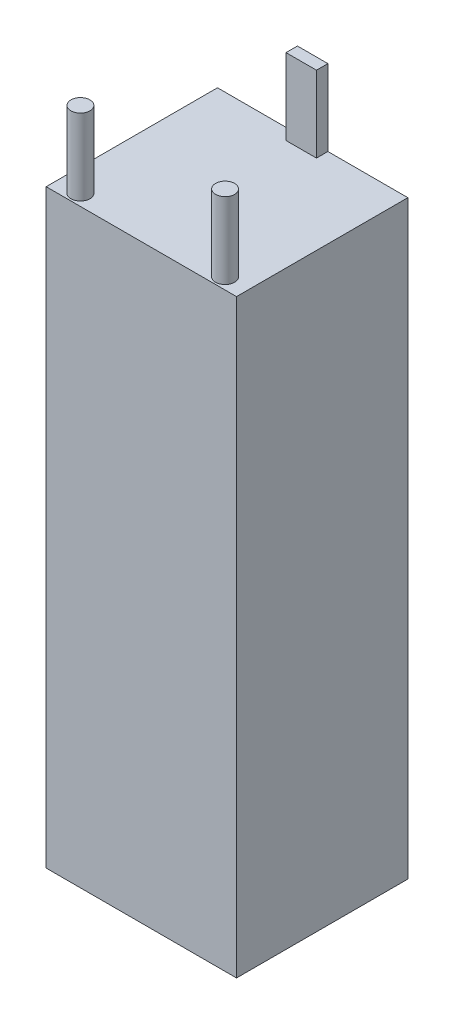
ISO-10303-21;
HEADER;
FILE_DESCRIPTION(('STEP AP214'),'2;1');
FILE_NAME('part.step','',(''),(''),'','','');
FILE_SCHEMA(('AUTOMOTIVE_DESIGN { 1 0 10303 214 1 1 1 1 }'));
ENDSEC;
DATA;
#1=APPLICATION_CONTEXT('core data for automotive mechanical design processes');
#2=APPLICATION_PROTOCOL_DEFINITION('international standard','automotive_design',2000,#1);
#3=PRODUCT_CONTEXT('',#1,'mechanical');
#4=PRODUCT('Part','Part','',(#3));
#5=PRODUCT_RELATED_PRODUCT_CATEGORY('part','',(#4));
#6=PRODUCT_DEFINITION_FORMATION('','',#4);
#7=PRODUCT_DEFINITION_CONTEXT('part definition',#1,'design');
#8=PRODUCT_DEFINITION('design','',#6,#7);
#9=PRODUCT_DEFINITION_SHAPE('','',#8);
#10=(LENGTH_UNIT() NAMED_UNIT(*) SI_UNIT(.MILLI.,.METRE.));
#11=(NAMED_UNIT(*) PLANE_ANGLE_UNIT() SI_UNIT($,.RADIAN.));
#12=(NAMED_UNIT(*) SI_UNIT($,.STERADIAN.) SOLID_ANGLE_UNIT());
#13=UNCERTAINTY_MEASURE_WITH_UNIT(LENGTH_MEASURE(1.E-05),#10,'distance_accuracy_value','');
#14=(GEOMETRIC_REPRESENTATION_CONTEXT(3) GLOBAL_UNCERTAINTY_ASSIGNED_CONTEXT((#13)) GLOBAL_UNIT_ASSIGNED_CONTEXT((#10,
#11,#12)) REPRESENTATION_CONTEXT('',''));
#15=CARTESIAN_POINT('',(0.,0.,0.));
#16=DIRECTION('',(0.,0.,1.));
#17=DIRECTION('',(1.,0.,0.));
#18=AXIS2_PLACEMENT_3D('',#15,#16,#17);
#19=CARTESIAN_POINT('',(25.,155.,22.5));
#20=DIRECTION('',(-1.,0.,0.));
#21=DIRECTION('',(0.,0.,1.));
#22=AXIS2_PLACEMENT_3D('',#19,#20,#21);
#23=PLANE('',#22);
#24=DIRECTION('',(0.,0.,-1.));
#25=VECTOR('',#24,1.);
#26=CARTESIAN_POINT('',(25.,0.,22.5));
#27=LINE('',#26,#25);
#28=CARTESIAN_POINT('',(25.,0.,22.5));
#29=VERTEX_POINT('',#28);
#30=CARTESIAN_POINT('',(25.,0.,-22.5));
#31=VERTEX_POINT('',#30);
#32=EDGE_CURVE('E169',#29,#31,#27,.T.);
#33=ORIENTED_EDGE('',*,*,#32,.T.);
#34=DIRECTION('',(0.,-1.,0.));
#35=VECTOR('',#34,1.);
#36=CARTESIAN_POINT('',(25.,155.,-22.5));
#37=LINE('',#36,#35);
#38=CARTESIAN_POINT('',(25.,155.,-22.5));
#39=VERTEX_POINT('',#38);
#40=EDGE_CURVE('E193',#39,#31,#37,.T.);
#41=ORIENTED_EDGE('',*,*,#40,.F.);
#42=DIRECTION('',(0.,0.,-1.));
#43=VECTOR('',#42,1.);
#44=CARTESIAN_POINT('',(25.,155.,22.5));
#45=LINE('',#44,#43);
#46=CARTESIAN_POINT('',(25.,155.,22.5));
#47=VERTEX_POINT('',#46);
#48=EDGE_CURVE('E153',#47,#39,#45,.T.);
#49=ORIENTED_EDGE('',*,*,#48,.F.);
#50=DIRECTION('',(0.,-1.,0.));
#51=VECTOR('',#50,1.);
#52=CARTESIAN_POINT('',(25.,155.,22.5));
#53=LINE('',#52,#51);
#54=EDGE_CURVE('E168',#47,#29,#53,.T.);
#55=ORIENTED_EDGE('',*,*,#54,.T.);
#56=EDGE_LOOP('',(#33,#41,#49,#55));
#57=FACE_BOUND('',#56,.T.);
#58=ADVANCED_FACE('F45',(#57),#23,.F.);
#59=CARTESIAN_POINT('',(-25.,155.,-22.5));
#60=DIRECTION('',(0.,0.,1.));
#61=DIRECTION('',(1.,0.,0.));
#62=AXIS2_PLACEMENT_3D('',#59,#60,#61);
#63=PLANE('',#62);
#64=DIRECTION('',(-1.,0.,0.));
#65=VECTOR('',#64,1.);
#66=CARTESIAN_POINT('',(-25.,0.,-22.5));
#67=LINE('',#66,#65);
#68=CARTESIAN_POINT('',(-25.,0.,-22.5));
#69=VERTEX_POINT('',#68);
#70=EDGE_CURVE('E173',#31,#69,#67,.T.);
#71=ORIENTED_EDGE('',*,*,#70,.T.);
#72=DIRECTION('',(0.,-1.,0.));
#73=VECTOR('',#72,1.);
#74=CARTESIAN_POINT('',(-25.,155.,-22.5));
#75=LINE('',#74,#73);
#76=CARTESIAN_POINT('',(-25.,155.,-22.5));
#77=VERTEX_POINT('',#76);
#78=EDGE_CURVE('E189',#77,#69,#75,.T.);
#79=ORIENTED_EDGE('',*,*,#78,.F.);
#80=DIRECTION('',(-1.,0.,0.));
#81=VECTOR('',#80,1.);
#82=CARTESIAN_POINT('',(-25.,155.,-22.5));
#83=LINE('',#82,#81);
#84=CARTESIAN_POINT('',(-4.00000000000001,155.,-22.5));
#85=VERTEX_POINT('',#84);
#86=EDGE_CURVE('E157',#85,#77,#83,.T.);
#87=ORIENTED_EDGE('',*,*,#86,.F.);
#88=DIRECTION('',(0.,-1.,0.));
#89=VECTOR('',#88,1.);
#90=CARTESIAN_POINT('',(-4.,175.,-22.5));
#91=LINE('',#90,#89);
#92=CARTESIAN_POINT('',(-4.,175.,-22.5));
#93=VERTEX_POINT('',#92);
#94=EDGE_CURVE('E124',#93,#85,#91,.T.);
#95=ORIENTED_EDGE('',*,*,#94,.F.);
#96=DIRECTION('',(-1.,0.,0.));
#97=VECTOR('',#96,1.);
#98=CARTESIAN_POINT('',(-4.,175.,-22.5));
#99=LINE('',#98,#97);
#100=CARTESIAN_POINT('',(4.,175.,-22.5));
#101=VERTEX_POINT('',#100);
#102=EDGE_CURVE('E147',#101,#93,#99,.T.);
#103=ORIENTED_EDGE('',*,*,#102,.F.);
#104=DIRECTION('',(0.,-1.,0.));
#105=VECTOR('',#104,1.);
#106=CARTESIAN_POINT('',(4.,175.,-22.5));
#107=LINE('',#106,#105);
#108=CARTESIAN_POINT('',(3.99999999999999,155.,-22.5));
#109=VERTEX_POINT('',#108);
#110=EDGE_CURVE('E135',#101,#109,#107,.T.);
#111=ORIENTED_EDGE('',*,*,#110,.T.);
#112=EDGE_CURVE('E159',#39,#109,#83,.T.);
#113=ORIENTED_EDGE('',*,*,#112,.F.);
#114=ORIENTED_EDGE('',*,*,#40,.T.);
#115=EDGE_LOOP('',(#71,#79,#87,#95,#103,#111,#113,#114));
#116=FACE_BOUND('',#115,.T.);
#117=ADVANCED_FACE('F219',(#116),#63,.F.);
#118=CARTESIAN_POINT('',(-25.,155.,22.5));
#119=DIRECTION('',(1.,0.,0.));
#120=DIRECTION('',(0.,0.,-1.));
#121=AXIS2_PLACEMENT_3D('',#118,#119,#120);
#122=PLANE('',#121);
#123=DIRECTION('',(0.,0.,1.));
#124=VECTOR('',#123,1.);
#125=CARTESIAN_POINT('',(-25.,0.,22.5));
#126=LINE('',#125,#124);
#127=CARTESIAN_POINT('',(-25.,0.,22.5));
#128=VERTEX_POINT('',#127);
#129=EDGE_CURVE('E177',#69,#128,#126,.T.);
#130=ORIENTED_EDGE('',*,*,#129,.T.);
#131=DIRECTION('',(0.,-1.,0.));
#132=VECTOR('',#131,1.);
#133=CARTESIAN_POINT('',(-25.,155.,22.5));
#134=LINE('',#133,#132);
#135=CARTESIAN_POINT('',(-25.,155.,22.5));
#136=VERTEX_POINT('',#135);
#137=EDGE_CURVE('E185',#136,#128,#134,.T.);
#138=ORIENTED_EDGE('',*,*,#137,.F.);
#139=DIRECTION('',(0.,0.,1.));
#140=VECTOR('',#139,1.);
#141=CARTESIAN_POINT('',(-25.,155.,22.5));
#142=LINE('',#141,#140);
#143=EDGE_CURVE('E162',#77,#136,#142,.T.);
#144=ORIENTED_EDGE('',*,*,#143,.F.);
#145=ORIENTED_EDGE('',*,*,#78,.T.);
#146=EDGE_LOOP('',(#130,#138,#144,#145));
#147=FACE_BOUND('',#146,.T.);
#148=ADVANCED_FACE('F214',(#147),#122,.F.);
#149=CARTESIAN_POINT('',(-25.,155.,22.5));
#150=DIRECTION('',(0.,0.,-1.));
#151=DIRECTION('',(-1.,0.,0.));
#152=AXIS2_PLACEMENT_3D('',#149,#150,#151);
#153=PLANE('',#152);
#154=DIRECTION('',(1.,0.,0.));
#155=VECTOR('',#154,1.);
#156=CARTESIAN_POINT('',(-25.,0.,22.5));
#157=LINE('',#156,#155);
#158=EDGE_CURVE('E158',#128,#29,#157,.T.);
#159=ORIENTED_EDGE('',*,*,#158,.T.);
#160=ORIENTED_EDGE('',*,*,#54,.F.);
#161=DIRECTION('',(1.,0.,0.));
#162=VECTOR('',#161,1.);
#163=CARTESIAN_POINT('',(-25.,155.,22.5));
#164=LINE('',#163,#162);
#165=EDGE_CURVE('E165',#136,#47,#164,.T.);
#166=ORIENTED_EDGE('',*,*,#165,.F.);
#167=ORIENTED_EDGE('',*,*,#137,.T.);
#168=EDGE_LOOP('',(#159,#160,#166,#167));
#169=FACE_BOUND('',#168,.T.);
#170=ADVANCED_FACE('F204',(#169),#153,.F.);
#171=CARTESIAN_POINT('',(0.,155.,0.));
#172=DIRECTION('',(0.,-1.,0.));
#173=DIRECTION('',(0.,0.,-1.));
#174=AXIS2_PLACEMENT_3D('',#171,#172,#173);
#175=PLANE('',#174);
#176=DIRECTION('',(0.,0.,-1.));
#177=VECTOR('',#176,1.);
#178=CARTESIAN_POINT('',(4.,155.,-19.5));
#179=LINE('',#178,#177);
#180=CARTESIAN_POINT('',(4.,155.,-19.5));
#181=VERTEX_POINT('',#180);
#182=EDGE_CURVE('E60',#181,#109,#179,.T.);
#183=ORIENTED_EDGE('',*,*,#182,.F.);
#184=DIRECTION('',(1.,0.,0.));
#185=VECTOR('',#184,1.);
#186=CARTESIAN_POINT('',(-4.,155.,-19.5));
#187=LINE('',#186,#185);
#188=CARTESIAN_POINT('',(-4.,155.,-19.5));
#189=VERTEX_POINT('',#188);
#190=EDGE_CURVE('E106',#189,#181,#187,.T.);
#191=ORIENTED_EDGE('',*,*,#190,.F.);
#192=DIRECTION('',(0.,0.,1.));
#193=VECTOR('',#192,1.);
#194=CARTESIAN_POINT('',(-4.,155.,-19.5));
#195=LINE('',#194,#193);
#196=EDGE_CURVE('E66',#85,#189,#195,.T.);
#197=ORIENTED_EDGE('',*,*,#196,.F.);
#198=ORIENTED_EDGE('',*,*,#86,.T.);
#199=ORIENTED_EDGE('',*,*,#143,.T.);
#200=ORIENTED_EDGE('',*,*,#165,.T.);
#201=ORIENTED_EDGE('',*,*,#48,.T.);
#202=ORIENTED_EDGE('',*,*,#112,.T.);
#203=EDGE_LOOP('',(#183,#191,#197,#198,#199,#200,#201,#202));
#204=FACE_BOUND('',#203,.T.);
#205=CARTESIAN_POINT('',(-19.,155.,19.5));
#206=DIRECTION('',(0.,-1.,0.));
#207=DIRECTION('',(0.,0.,-1.));
#208=AXIS2_PLACEMENT_3D('',#205,#206,#207);
#209=CIRCLE('',#208,2.5);
#210=CARTESIAN_POINT('',(-19.,155.,17.));
#211=VERTEX_POINT('',#210);
#212=EDGE_CURVE('E11',#211,#211,#209,.F.);
#213=ORIENTED_EDGE('',*,*,#212,.F.);
#214=EDGE_LOOP('',(#213));
#215=FACE_BOUND('',#214,.T.);
#216=CARTESIAN_POINT('',(19.,155.,19.5));
#217=DIRECTION('',(0.,-1.,0.));
#218=DIRECTION('',(0.,0.,-1.));
#219=AXIS2_PLACEMENT_3D('',#216,#217,#218);
#220=CIRCLE('',#219,2.5);
#221=CARTESIAN_POINT('',(19.,155.,17.));
#222=VERTEX_POINT('',#221);
#223=EDGE_CURVE('E53',#222,#222,#220,.F.);
#224=ORIENTED_EDGE('',*,*,#223,.F.);
#225=EDGE_LOOP('',(#224));
#226=FACE_BOUND('',#225,.T.);
#227=ADVANCED_FACE('F107',(#204,#215,#226),#175,.F.);
#228=CARTESIAN_POINT('',(0.,0.,0.));
#229=DIRECTION('',(0.,-1.,0.));
#230=DIRECTION('',(0.,0.,-1.));
#231=AXIS2_PLACEMENT_3D('',#228,#229,#230);
#232=PLANE('',#231);
#233=ORIENTED_EDGE('',*,*,#32,.F.);
#234=ORIENTED_EDGE('',*,*,#158,.F.);
#235=ORIENTED_EDGE('',*,*,#129,.F.);
#236=ORIENTED_EDGE('',*,*,#70,.F.);
#237=EDGE_LOOP('',(#233,#234,#235,#236));
#238=FACE_BOUND('',#237,.T.);
#239=ADVANCED_FACE('F203',(#238),#232,.T.);
#240=CARTESIAN_POINT('',(19.,175.,19.5));
#241=DIRECTION('',(0.,-1.,0.));
#242=DIRECTION('',(0.,0.,-1.));
#243=AXIS2_PLACEMENT_3D('',#240,#241,#242);
#244=CYLINDRICAL_SURFACE('',#243,2.5);
#245=CARTESIAN_POINT('',(19.,175.,19.5));
#246=DIRECTION('',(0.,1.,0.));
#247=DIRECTION('',(0.,0.,1.));
#248=AXIS2_PLACEMENT_3D('',#245,#246,#247);
#249=CIRCLE('',#248,2.5);
#250=CARTESIAN_POINT('',(19.,175.,22.));
#251=VERTEX_POINT('',#250);
#252=EDGE_CURVE('E141',#251,#251,#249,.T.);
#253=ORIENTED_EDGE('',*,*,#252,.F.);
#254=EDGE_LOOP('',(#253));
#255=FACE_BOUND('',#254,.T.);
#256=ORIENTED_EDGE('',*,*,#223,.T.);
#257=EDGE_LOOP('',(#256));
#258=FACE_BOUND('',#257,.T.);
#259=ADVANCED_FACE('F200',(#255,#258),#244,.T.);
#260=CARTESIAN_POINT('',(19.,175.,19.5));
#261=DIRECTION('',(0.,1.,0.));
#262=DIRECTION('',(0.,0.,1.));
#263=AXIS2_PLACEMENT_3D('',#260,#261,#262);
#264=PLANE('',#263);
#265=ORIENTED_EDGE('',*,*,#252,.T.);
#266=EDGE_LOOP('',(#265));
#267=FACE_BOUND('',#266,.T.);
#268=ADVANCED_FACE('F248',(#267),#264,.T.);
#269=CARTESIAN_POINT('',(-19.,175.,19.5));
#270=DIRECTION('',(0.,-1.,0.));
#271=DIRECTION('',(0.,0.,-1.));
#272=AXIS2_PLACEMENT_3D('',#269,#270,#271);
#273=CYLINDRICAL_SURFACE('',#272,2.5);
#274=CARTESIAN_POINT('',(-19.,175.,19.5));
#275=DIRECTION('',(0.,1.,0.));
#276=DIRECTION('',(0.,0.,1.));
#277=AXIS2_PLACEMENT_3D('',#274,#275,#276);
#278=CIRCLE('',#277,2.5);
#279=CARTESIAN_POINT('',(-19.,175.,22.));
#280=VERTEX_POINT('',#279);
#281=EDGE_CURVE('E174',#280,#280,#278,.T.);
#282=ORIENTED_EDGE('',*,*,#281,.F.);
#283=EDGE_LOOP('',(#282));
#284=FACE_BOUND('',#283,.T.);
#285=ORIENTED_EDGE('',*,*,#212,.T.);
#286=EDGE_LOOP('',(#285));
#287=FACE_BOUND('',#286,.T.);
#288=ADVANCED_FACE('F254',(#284,#287),#273,.T.);
#289=CARTESIAN_POINT('',(-19.,175.,19.5));
#290=DIRECTION('',(0.,1.,0.));
#291=DIRECTION('',(0.,0.,1.));
#292=AXIS2_PLACEMENT_3D('',#289,#290,#291);
#293=PLANE('',#292);
#294=ORIENTED_EDGE('',*,*,#281,.T.);
#295=EDGE_LOOP('',(#294));
#296=FACE_BOUND('',#295,.T.);
#297=ADVANCED_FACE('F262',(#296),#293,.T.);
#298=CARTESIAN_POINT('',(4.,175.,-19.5));
#299=DIRECTION('',(-1.,0.,0.));
#300=DIRECTION('',(0.,0.,1.));
#301=AXIS2_PLACEMENT_3D('',#298,#299,#300);
#302=PLANE('',#301);
#303=ORIENTED_EDGE('',*,*,#182,.T.);
#304=ORIENTED_EDGE('',*,*,#110,.F.);
#305=DIRECTION('',(0.,0.,-1.));
#306=VECTOR('',#305,1.);
#307=CARTESIAN_POINT('',(4.,175.,-19.5));
#308=LINE('',#307,#306);
#309=CARTESIAN_POINT('',(4.,175.,-19.5));
#310=VERTEX_POINT('',#309);
#311=EDGE_CURVE('E114',#310,#101,#308,.T.);
#312=ORIENTED_EDGE('',*,*,#311,.F.);
#313=DIRECTION('',(0.,-1.,0.));
#314=VECTOR('',#313,1.);
#315=CARTESIAN_POINT('',(4.,175.,-19.5));
#316=LINE('',#315,#314);
#317=EDGE_CURVE('E130',#310,#181,#316,.T.);
#318=ORIENTED_EDGE('',*,*,#317,.T.);
#319=EDGE_LOOP('',(#303,#304,#312,#318));
#320=FACE_BOUND('',#319,.T.);
#321=ADVANCED_FACE('F259',(#320),#302,.F.);
#322=CARTESIAN_POINT('',(-4.,175.,-19.5));
#323=DIRECTION('',(1.,0.,0.));
#324=DIRECTION('',(0.,0.,-1.));
#325=AXIS2_PLACEMENT_3D('',#322,#323,#324);
#326=PLANE('',#325);
#327=ORIENTED_EDGE('',*,*,#196,.T.);
#328=DIRECTION('',(0.,-1.,0.));
#329=VECTOR('',#328,1.);
#330=CARTESIAN_POINT('',(-4.,175.,-19.5));
#331=LINE('',#330,#329);
#332=CARTESIAN_POINT('',(-4.,175.,-19.5));
#333=VERTEX_POINT('',#332);
#334=EDGE_CURVE('E121',#333,#189,#331,.T.);
#335=ORIENTED_EDGE('',*,*,#334,.F.);
#336=DIRECTION('',(0.,0.,1.));
#337=VECTOR('',#336,1.);
#338=CARTESIAN_POINT('',(-4.,175.,-19.5));
#339=LINE('',#338,#337);
#340=EDGE_CURVE('E144',#93,#333,#339,.T.);
#341=ORIENTED_EDGE('',*,*,#340,.F.);
#342=ORIENTED_EDGE('',*,*,#94,.T.);
#343=EDGE_LOOP('',(#327,#335,#341,#342));
#344=FACE_BOUND('',#343,.T.);
#345=ADVANCED_FACE('F119',(#344),#326,.F.);
#346=CARTESIAN_POINT('',(-4.,175.,-19.5));
#347=DIRECTION('',(0.,0.,-1.));
#348=DIRECTION('',(-1.,0.,0.));
#349=AXIS2_PLACEMENT_3D('',#346,#347,#348);
#350=PLANE('',#349);
#351=ORIENTED_EDGE('',*,*,#190,.T.);
#352=ORIENTED_EDGE('',*,*,#317,.F.);
#353=DIRECTION('',(1.,0.,0.));
#354=VECTOR('',#353,1.);
#355=CARTESIAN_POINT('',(-4.,175.,-19.5));
#356=LINE('',#355,#354);
#357=EDGE_CURVE('E128',#333,#310,#356,.T.);
#358=ORIENTED_EDGE('',*,*,#357,.F.);
#359=ORIENTED_EDGE('',*,*,#334,.T.);
#360=EDGE_LOOP('',(#351,#352,#358,#359));
#361=FACE_BOUND('',#360,.T.);
#362=ADVANCED_FACE('F127',(#361),#350,.F.);
#363=CARTESIAN_POINT('',(0.,175.,0.));
#364=DIRECTION('',(0.,-1.,0.));
#365=DIRECTION('',(0.,0.,-1.));
#366=AXIS2_PLACEMENT_3D('',#363,#364,#365);
#367=PLANE('',#366);
#368=ORIENTED_EDGE('',*,*,#311,.T.);
#369=ORIENTED_EDGE('',*,*,#102,.T.);
#370=ORIENTED_EDGE('',*,*,#340,.T.);
#371=ORIENTED_EDGE('',*,*,#357,.T.);
#372=EDGE_LOOP('',(#368,#369,#370,#371));
#373=FACE_BOUND('',#372,.T.);
#374=ADVANCED_FACE('F267',(#373),#367,.F.);
#375=CLOSED_SHELL('',(#58,#117,#148,#170,#227,#239,#259,#268,#288,#297,#321,#345,#362,#374));
#376=MANIFOLD_SOLID_BREP('B2',#375);
#377=ADVANCED_BREP_SHAPE_REPRESENTATION('',(#18,#376),#14);
#378=SHAPE_DEFINITION_REPRESENTATION(#9,#377);
ENDSEC;
END-ISO-10303-21;
